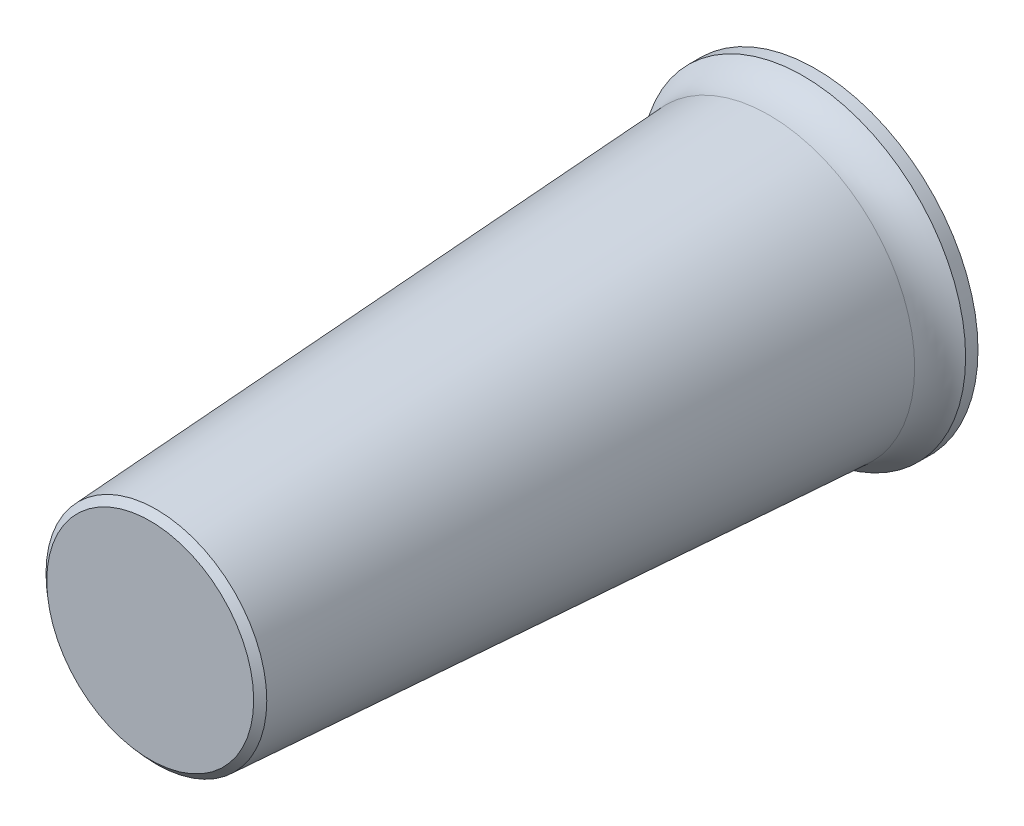
ISO-10303-21;
HEADER;
FILE_DESCRIPTION(('STEP AP214'),'2;1');
FILE_NAME('part.step','',(''),(''),'','','');
FILE_SCHEMA(('AUTOMOTIVE_DESIGN { 1 0 10303 214 1 1 1 1 }'));
ENDSEC;
DATA;
#1=APPLICATION_CONTEXT('core data for automotive mechanical design processes');
#2=APPLICATION_PROTOCOL_DEFINITION('international standard','automotive_design',2000,#1);
#3=PRODUCT_CONTEXT('',#1,'mechanical');
#4=PRODUCT('Part','Part','',(#3));
#5=PRODUCT_RELATED_PRODUCT_CATEGORY('part','',(#4));
#6=PRODUCT_DEFINITION_FORMATION('','',#4);
#7=PRODUCT_DEFINITION_CONTEXT('part definition',#1,'design');
#8=PRODUCT_DEFINITION('design','',#6,#7);
#9=PRODUCT_DEFINITION_SHAPE('','',#8);
#10=(LENGTH_UNIT() NAMED_UNIT(*) SI_UNIT(.MILLI.,.METRE.));
#11=(NAMED_UNIT(*) PLANE_ANGLE_UNIT() SI_UNIT($,.RADIAN.));
#12=(NAMED_UNIT(*) SI_UNIT($,.STERADIAN.) SOLID_ANGLE_UNIT());
#13=UNCERTAINTY_MEASURE_WITH_UNIT(LENGTH_MEASURE(1.E-05),#10,'distance_accuracy_value','');
#14=(GEOMETRIC_REPRESENTATION_CONTEXT(3) GLOBAL_UNCERTAINTY_ASSIGNED_CONTEXT((#13)) GLOBAL_UNIT_ASSIGNED_CONTEXT((#10,
#11,#12)) REPRESENTATION_CONTEXT('',''));
#15=CARTESIAN_POINT('',(0.,0.,0.));
#16=DIRECTION('',(0.,0.,1.));
#17=DIRECTION('',(1.,0.,0.));
#18=AXIS2_PLACEMENT_3D('',#15,#16,#17);
#19=CARTESIAN_POINT('',(0.,0.,0.800001221567654));
#20=DIRECTION('',(0.,0.,1.));
#21=DIRECTION('',(1.,0.,0.));
#22=AXIS2_PLACEMENT_3D('',#19,#20,#21);
#23=TOROIDAL_SURFACE('',#22,3.15367345329122,0.8);
#24=CARTESIAN_POINT('',(0.,0.,0.75395));
#25=DIRECTION('',(0.,0.,1.));
#26=DIRECTION('',(1.,0.,0.));
#27=AXIS2_PLACEMENT_3D('',#24,#25,#26);
#28=CIRCLE('',#27,2.355);
#29=CARTESIAN_POINT('',(2.355,0.,0.75395));
#30=VERTEX_POINT('',#29);
#31=EDGE_CURVE('E62',#30,#30,#28,.T.);
#32=ORIENTED_EDGE('',*,*,#31,.F.);
#33=EDGE_LOOP('',(#32));
#34=FACE_BOUND('',#33,.T.);
#35=CARTESIAN_POINT('',(0.,0.,0.200000000000001));
#36=DIRECTION('',(0.,0.,1.));
#37=DIRECTION('',(1.,0.,0.));
#38=AXIS2_PLACEMENT_3D('',#35,#36,#37);
#39=CIRCLE('',#38,2.62452457620905);
#40=CARTESIAN_POINT('',(2.62452457620905,0.,0.200000000000001));
#41=VERTEX_POINT('',#40);
#42=EDGE_CURVE('E73',#41,#41,#39,.T.);
#43=ORIENTED_EDGE('',*,*,#42,.T.);
#44=EDGE_LOOP('',(#43));
#45=FACE_BOUND('',#44,.T.);
#46=ADVANCED_FACE('F45',(#34,#45),#23,.F.);
#47=CARTESIAN_POINT('',(0.,0.,0.75395));
#48=DIRECTION('',(0.,0.,-1.));
#49=DIRECTION('',(-1.,0.,0.));
#50=AXIS2_PLACEMENT_3D('',#47,#48,#49);
#51=CONICAL_SURFACE('',#50,2.355,0.0575958653158132);
#52=CARTESIAN_POINT('',(0.,0.,10.6541158183386));
#53=DIRECTION('',(0.,0.,1.));
#54=DIRECTION('',(1.,0.,0.));
#55=AXIS2_PLACEMENT_3D('',#52,#53,#54);
#56=CIRCLE('',#55,1.78416003057562);
#57=CARTESIAN_POINT('',(1.78416003057562,0.,10.6541158183386));
#58=VERTEX_POINT('',#57);
#59=EDGE_CURVE('E10',#58,#58,#56,.F.);
#60=ORIENTED_EDGE('',*,*,#59,.T.);
#61=EDGE_LOOP('',(#60));
#62=FACE_BOUND('',#61,.T.);
#63=ORIENTED_EDGE('',*,*,#31,.T.);
#64=EDGE_LOOP('',(#63));
#65=FACE_BOUND('',#64,.T.);
#66=ADVANCED_FACE('F93',(#62,#65),#51,.T.);
#67=CARTESIAN_POINT('',(0.,0.,10.75395));
#68=DIRECTION('',(0.,0.,-1.));
#69=DIRECTION('',(-1.,0.,0.));
#70=AXIS2_PLACEMENT_3D('',#67,#68,#69);
#71=PLANE('',#70);
#72=CARTESIAN_POINT('',(0.,0.,10.75395));
#73=DIRECTION('',(0.,0.,-1.));
#74=DIRECTION('',(-1.,0.,0.));
#75=AXIS2_PLACEMENT_3D('',#72,#73,#74);
#76=CIRCLE('',#75,1.67210860146675);
#77=CARTESIAN_POINT('',(-1.67210860146675,0.,10.75395));
#78=VERTEX_POINT('',#77);
#79=EDGE_CURVE('E54',#78,#78,#76,.F.);
#80=ORIENTED_EDGE('',*,*,#79,.T.);
#81=EDGE_LOOP('',(#80));
#82=FACE_BOUND('',#81,.T.);
#83=ADVANCED_FACE('F87',(#82),#71,.F.);
#84=CARTESIAN_POINT('',(0.,0.,0.));
#85=DIRECTION('',(0.,0.,1.));
#86=DIRECTION('',(1.,0.,0.));
#87=AXIS2_PLACEMENT_3D('',#84,#85,#86);
#88=PLANE('',#87);
#89=CARTESIAN_POINT('',(0.,0.,0.));
#90=DIRECTION('',(0.,0.,1.));
#91=DIRECTION('',(1.,0.,0.));
#92=AXIS2_PLACEMENT_3D('',#89,#90,#91);
#93=CIRCLE('',#92,2.62452457620905);
#94=CARTESIAN_POINT('',(2.62452457620905,0.,0.));
#95=VERTEX_POINT('',#94);
#96=EDGE_CURVE('E68',#95,#95,#93,.T.);
#97=ORIENTED_EDGE('',*,*,#96,.F.);
#98=EDGE_LOOP('',(#97));
#99=FACE_BOUND('',#98,.T.);
#100=ADVANCED_FACE('F82',(#99),#88,.F.);
#101=CARTESIAN_POINT('',(0.,0.,14.0337308707124));
#102=DIRECTION('',(0.,0.,1.));
#103=DIRECTION('',(1.,0.,0.));
#104=AXIS2_PLACEMENT_3D('',#101,#102,#103);
#105=CYLINDRICAL_SURFACE('',#104,2.62452457620905);
#106=ORIENTED_EDGE('',*,*,#42,.F.);
#107=EDGE_LOOP('',(#106));
#108=FACE_BOUND('',#107,.T.);
#109=ORIENTED_EDGE('',*,*,#96,.T.);
#110=EDGE_LOOP('',(#109));
#111=FACE_BOUND('',#110,.T.);
#112=ADVANCED_FACE('F79',(#108,#111),#105,.T.);
#113=CARTESIAN_POINT('',(0.,0.,10.75395));
#114=DIRECTION('',(0.,0.,-1.));
#115=DIRECTION('',(-1.,0.,0.));
#116=AXIS2_PLACEMENT_3D('',#113,#114,#115);
#117=CONICAL_SURFACE('',#116,1.67210860146675,0.842994028713262);
#118=ORIENTED_EDGE('',*,*,#59,.F.);
#119=EDGE_LOOP('',(#118));
#120=FACE_BOUND('',#119,.T.);
#121=ORIENTED_EDGE('',*,*,#79,.F.);
#122=EDGE_LOOP('',(#121));
#123=FACE_BOUND('',#122,.T.);
#124=ADVANCED_FACE('F48',(#120,#123),#117,.T.);
#125=CLOSED_SHELL('',(#46,#66,#83,#100,#112,#124));
#126=MANIFOLD_SOLID_BREP('B2',#125);
#127=ADVANCED_BREP_SHAPE_REPRESENTATION('',(#18,#126),#14);
#128=SHAPE_DEFINITION_REPRESENTATION(#9,#127);
ENDSEC;
END-ISO-10303-21;
